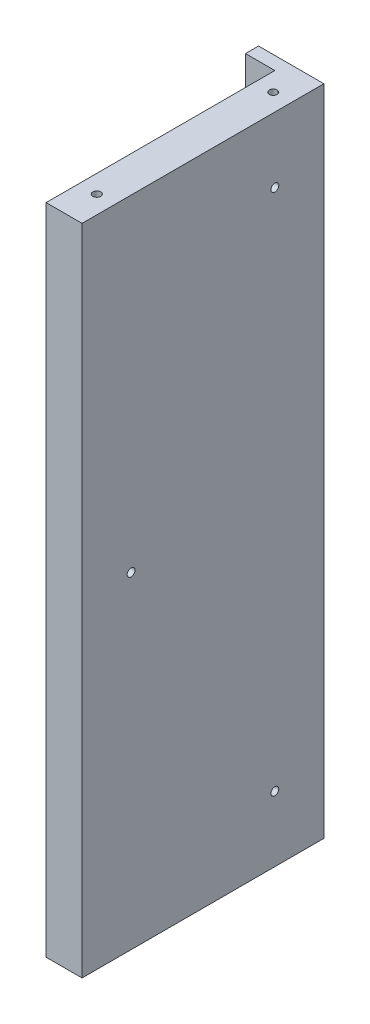
ISO-10303-21;
HEADER;
FILE_DESCRIPTION(('STEP AP214'),'2;1');
FILE_NAME('part.step','',(''),(''),'','','');
FILE_SCHEMA(('AUTOMOTIVE_DESIGN { 1 0 10303 214 1 1 1 1 }'));
ENDSEC;
DATA;
#1=APPLICATION_CONTEXT('core data for automotive mechanical design processes');
#2=APPLICATION_PROTOCOL_DEFINITION('international standard','automotive_design',2000,#1);
#3=PRODUCT_CONTEXT('',#1,'mechanical');
#4=PRODUCT('Part','Part','',(#3));
#5=PRODUCT_RELATED_PRODUCT_CATEGORY('part','',(#4));
#6=PRODUCT_DEFINITION_FORMATION('','',#4);
#7=PRODUCT_DEFINITION_CONTEXT('part definition',#1,'design');
#8=PRODUCT_DEFINITION('design','',#6,#7);
#9=PRODUCT_DEFINITION_SHAPE('','',#8);
#10=(LENGTH_UNIT() NAMED_UNIT(*) SI_UNIT(.MILLI.,.METRE.));
#11=(NAMED_UNIT(*) PLANE_ANGLE_UNIT() SI_UNIT($,.RADIAN.));
#12=(NAMED_UNIT(*) SI_UNIT($,.STERADIAN.) SOLID_ANGLE_UNIT());
#13=UNCERTAINTY_MEASURE_WITH_UNIT(LENGTH_MEASURE(1.E-05),#10,'distance_accuracy_value','');
#14=(GEOMETRIC_REPRESENTATION_CONTEXT(3) GLOBAL_UNCERTAINTY_ASSIGNED_CONTEXT((#13)) GLOBAL_UNIT_ASSIGNED_CONTEXT((#10,
#11,#12)) REPRESENTATION_CONTEXT('',''));
#15=CARTESIAN_POINT('',(0.,0.,0.));
#16=DIRECTION('',(0.,0.,1.));
#17=DIRECTION('',(1.,0.,0.));
#18=AXIS2_PLACEMENT_3D('',#15,#16,#17);
#19=CARTESIAN_POINT('',(9.99999999999999,200.,-50.));
#20=DIRECTION('',(-1.,0.,0.));
#21=DIRECTION('',(0.,0.,1.));
#22=AXIS2_PLACEMENT_3D('',#19,#20,#21);
#23=PLANE('',#22);
#24=CARTESIAN_POINT('',(10.,20.,-9.00000000000002));
#25=DIRECTION('',(1.,0.,0.));
#26=DIRECTION('',(0.,0.,-1.));
#27=AXIS2_PLACEMENT_3D('',#24,#25,#26);
#28=CIRCLE('',#27,1.19999999999999);
#29=CARTESIAN_POINT('',(10.,20.,-10.2));
#30=VERTEX_POINT('',#29);
#31=EDGE_CURVE('E214',#30,#30,#28,.T.);
#32=ORIENTED_EDGE('',*,*,#31,.F.);
#33=EDGE_LOOP('',(#32));
#34=FACE_BOUND('',#33,.T.);
#35=CARTESIAN_POINT('',(10.,180.,-9.00000000000002));
#36=DIRECTION('',(1.,0.,0.));
#37=DIRECTION('',(0.,0.,-1.));
#38=AXIS2_PLACEMENT_3D('',#35,#36,#37);
#39=CIRCLE('',#38,1.19999999999998);
#40=CARTESIAN_POINT('',(10.,180.,-10.2));
#41=VERTEX_POINT('',#40);
#42=EDGE_CURVE('E218',#41,#41,#39,.T.);
#43=ORIENTED_EDGE('',*,*,#42,.F.);
#44=EDGE_LOOP('',(#43));
#45=FACE_BOUND('',#44,.T.);
#46=CARTESIAN_POINT('',(10.,100.,35.));
#47=DIRECTION('',(1.,0.,0.));
#48=DIRECTION('',(0.,0.,-1.));
#49=AXIS2_PLACEMENT_3D('',#46,#47,#48);
#50=CIRCLE('',#49,1.19999999999999);
#51=CARTESIAN_POINT('',(10.,100.,33.8));
#52=VERTEX_POINT('',#51);
#53=EDGE_CURVE('E222',#52,#52,#50,.T.);
#54=ORIENTED_EDGE('',*,*,#53,.F.);
#55=EDGE_LOOP('',(#54));
#56=FACE_BOUND('',#55,.T.);
#57=DIRECTION('',(0.,0.,-1.));
#58=VECTOR('',#57,1.);
#59=CARTESIAN_POINT('',(9.99999999999999,0.,-50.));
#60=LINE('',#59,#58);
#61=CARTESIAN_POINT('',(10.,0.,50.));
#62=VERTEX_POINT('',#61);
#63=CARTESIAN_POINT('',(10.,0.,-24.));
#64=VERTEX_POINT('',#63);
#65=EDGE_CURVE('E165',#62,#64,#60,.T.);
#66=ORIENTED_EDGE('',*,*,#65,.T.);
#67=DIRECTION('',(0.,-1.,0.));
#68=VECTOR('',#67,1.);
#69=CARTESIAN_POINT('',(9.99999999999999,200.,-24.));
#70=LINE('',#69,#68);
#71=CARTESIAN_POINT('',(9.99999999999999,200.,-24.));
#72=VERTEX_POINT('',#71);
#73=EDGE_CURVE('E51',#72,#64,#70,.T.);
#74=ORIENTED_EDGE('',*,*,#73,.F.);
#75=DIRECTION('',(0.,0.,-1.));
#76=VECTOR('',#75,1.);
#77=CARTESIAN_POINT('',(9.99999999999999,200.,-50.));
#78=LINE('',#77,#76);
#79=CARTESIAN_POINT('',(10.,200.,50.));
#80=VERTEX_POINT('',#79);
#81=EDGE_CURVE('E169',#80,#72,#78,.T.);
#82=ORIENTED_EDGE('',*,*,#81,.F.);
#83=DIRECTION('',(0.,-1.,0.));
#84=VECTOR('',#83,1.);
#85=CARTESIAN_POINT('',(10.,200.,50.));
#86=LINE('',#85,#84);
#87=EDGE_CURVE('E11',#80,#62,#86,.T.);
#88=ORIENTED_EDGE('',*,*,#87,.T.);
#89=EDGE_LOOP('',(#66,#74,#82,#88));
#90=FACE_BOUND('',#89,.T.);
#91=ADVANCED_FACE('F35',(#34,#45,#56,#90),#23,.F.);
#92=CARTESIAN_POINT('',(-10.,200.,-50.));
#93=DIRECTION('',(1.,0.,0.));
#94=DIRECTION('',(0.,0.,-1.));
#95=AXIS2_PLACEMENT_3D('',#92,#93,#94);
#96=PLANE('',#95);
#97=DIRECTION('',(0.,0.,1.));
#98=VECTOR('',#97,1.);
#99=CARTESIAN_POINT('',(-10.,200.,-50.));
#100=LINE('',#99,#98);
#101=CARTESIAN_POINT('',(-10.,200.,-24.));
#102=VERTEX_POINT('',#101);
#103=CARTESIAN_POINT('',(-9.99999999999999,200.,-20.));
#104=VERTEX_POINT('',#103);
#105=EDGE_CURVE('E172',#102,#104,#100,.T.);
#106=ORIENTED_EDGE('',*,*,#105,.F.);
#107=DIRECTION('',(0.,-1.,0.));
#108=VECTOR('',#107,1.);
#109=CARTESIAN_POINT('',(-10.,200.,-24.));
#110=LINE('',#109,#108);
#111=CARTESIAN_POINT('',(-10.,0.,-24.));
#112=VERTEX_POINT('',#111);
#113=EDGE_CURVE('E128',#102,#112,#110,.T.);
#114=ORIENTED_EDGE('',*,*,#113,.T.);
#115=DIRECTION('',(0.,0.,1.));
#116=VECTOR('',#115,1.);
#117=CARTESIAN_POINT('',(-10.,0.,-50.));
#118=LINE('',#117,#116);
#119=CARTESIAN_POINT('',(-9.99999999999999,0.,-20.));
#120=VERTEX_POINT('',#119);
#121=EDGE_CURVE('E178',#112,#120,#118,.T.);
#122=ORIENTED_EDGE('',*,*,#121,.T.);
#123=DIRECTION('',(0.,1.,0.));
#124=VECTOR('',#123,1.);
#125=CARTESIAN_POINT('',(-9.99999999999999,0.,-20.));
#126=LINE('',#125,#124);
#127=EDGE_CURVE('E162',#120,#104,#126,.T.);
#128=ORIENTED_EDGE('',*,*,#127,.T.);
#129=EDGE_LOOP('',(#106,#114,#122,#128));
#130=FACE_BOUND('',#129,.T.);
#131=ADVANCED_FACE('F204',(#130),#96,.F.);
#132=CARTESIAN_POINT('',(-9.99999999999999,200.,50.));
#133=DIRECTION('',(0.,0.,-1.));
#134=DIRECTION('',(-1.,0.,0.));
#135=AXIS2_PLACEMENT_3D('',#132,#133,#134);
#136=PLANE('',#135);
#137=DIRECTION('',(1.,0.,0.));
#138=VECTOR('',#137,1.);
#139=CARTESIAN_POINT('',(-9.99999999999999,200.,50.));
#140=LINE('',#139,#138);
#141=CARTESIAN_POINT('',(-0.999999999999996,200.,50.));
#142=VERTEX_POINT('',#141);
#143=EDGE_CURVE('E43',#142,#80,#140,.T.);
#144=ORIENTED_EDGE('',*,*,#143,.F.);
#145=DIRECTION('',(0.,1.,0.));
#146=VECTOR('',#145,1.);
#147=CARTESIAN_POINT('',(-0.999999999999996,0.,50.));
#148=LINE('',#147,#146);
#149=CARTESIAN_POINT('',(-0.999999999999996,0.,50.));
#150=VERTEX_POINT('',#149);
#151=EDGE_CURVE('E157',#150,#142,#148,.T.);
#152=ORIENTED_EDGE('',*,*,#151,.F.);
#153=DIRECTION('',(1.,0.,0.));
#154=VECTOR('',#153,1.);
#155=CARTESIAN_POINT('',(-9.99999999999999,0.,50.));
#156=LINE('',#155,#154);
#157=EDGE_CURVE('E173',#150,#62,#156,.T.);
#158=ORIENTED_EDGE('',*,*,#157,.T.);
#159=ORIENTED_EDGE('',*,*,#87,.F.);
#160=EDGE_LOOP('',(#144,#152,#158,#159));
#161=FACE_BOUND('',#160,.T.);
#162=ADVANCED_FACE('F209',(#161),#136,.F.);
#163=CARTESIAN_POINT('',(0.,200.,0.));
#164=DIRECTION('',(0.,1.,0.));
#165=DIRECTION('',(0.,0.,1.));
#166=AXIS2_PLACEMENT_3D('',#163,#164,#165);
#167=PLANE('',#166);
#168=CARTESIAN_POINT('',(4.50000000000001,200.,-14.));
#169=DIRECTION('',(0.,1.,0.));
#170=DIRECTION('',(0.,0.,1.));
#171=AXIS2_PLACEMENT_3D('',#168,#169,#170);
#172=CIRCLE('',#171,1.19999999999999);
#173=CARTESIAN_POINT('',(4.50000000000001,200.,-12.8));
#174=VERTEX_POINT('',#173);
#175=EDGE_CURVE('E111',#174,#174,#172,.T.);
#176=ORIENTED_EDGE('',*,*,#175,.F.);
#177=EDGE_LOOP('',(#176));
#178=FACE_BOUND('',#177,.T.);
#179=DIRECTION('',(-1.,0.,0.));
#180=VECTOR('',#179,1.);
#181=CARTESIAN_POINT('',(9.99999999999999,200.,-24.));
#182=LINE('',#181,#180);
#183=EDGE_CURVE('E124',#72,#102,#182,.T.);
#184=ORIENTED_EDGE('',*,*,#183,.T.);
#185=ORIENTED_EDGE('',*,*,#105,.T.);
#186=DIRECTION('',(-1.,0.,0.));
#187=VECTOR('',#186,1.);
#188=CARTESIAN_POINT('',(-9.99999999999999,200.,-20.));
#189=LINE('',#188,#187);
#190=CARTESIAN_POINT('',(-0.999999999999996,200.,-20.));
#191=VERTEX_POINT('',#190);
#192=EDGE_CURVE('E155',#191,#104,#189,.T.);
#193=ORIENTED_EDGE('',*,*,#192,.F.);
#194=DIRECTION('',(0.,0.,-1.));
#195=VECTOR('',#194,1.);
#196=CARTESIAN_POINT('',(-0.999999999999996,200.,50.));
#197=LINE('',#196,#195);
#198=EDGE_CURVE('E151',#142,#191,#197,.T.);
#199=ORIENTED_EDGE('',*,*,#198,.F.);
#200=ORIENTED_EDGE('',*,*,#143,.T.);
#201=ORIENTED_EDGE('',*,*,#81,.T.);
#202=EDGE_LOOP('',(#184,#185,#193,#199,#200,#201));
#203=FACE_BOUND('',#202,.T.);
#204=CARTESIAN_POINT('',(4.50000000000001,200.,40.));
#205=DIRECTION('',(0.,1.,0.));
#206=DIRECTION('',(0.,0.,1.));
#207=AXIS2_PLACEMENT_3D('',#204,#205,#206);
#208=CIRCLE('',#207,1.19999999999999);
#209=CARTESIAN_POINT('',(4.50000000000001,200.,41.2));
#210=VERTEX_POINT('',#209);
#211=EDGE_CURVE('E145',#210,#210,#208,.T.);
#212=ORIENTED_EDGE('',*,*,#211,.F.);
#213=EDGE_LOOP('',(#212));
#214=FACE_BOUND('',#213,.T.);
#215=ADVANCED_FACE('F234',(#178,#203,#214),#167,.T.);
#216=CARTESIAN_POINT('',(0.,0.,0.));
#217=DIRECTION('',(0.,1.,0.));
#218=DIRECTION('',(0.,0.,1.));
#219=AXIS2_PLACEMENT_3D('',#216,#217,#218);
#220=PLANE('',#219);
#221=CARTESIAN_POINT('',(4.50000000000001,0.,-14.));
#222=DIRECTION('',(0.,-1.,0.));
#223=DIRECTION('',(0.,0.,-1.));
#224=AXIS2_PLACEMENT_3D('',#221,#222,#223);
#225=CIRCLE('',#224,1.19999999999999);
#226=CARTESIAN_POINT('',(4.50000000000001,0.,-15.2));
#227=VERTEX_POINT('',#226);
#228=EDGE_CURVE('E110',#227,#227,#225,.T.);
#229=ORIENTED_EDGE('',*,*,#228,.F.);
#230=EDGE_LOOP('',(#229));
#231=FACE_BOUND('',#230,.T.);
#232=CARTESIAN_POINT('',(4.50000000000001,0.,40.));
#233=DIRECTION('',(0.,-1.,0.));
#234=DIRECTION('',(0.,0.,-1.));
#235=AXIS2_PLACEMENT_3D('',#232,#233,#234);
#236=CIRCLE('',#235,1.19999999999999);
#237=CARTESIAN_POINT('',(4.50000000000001,0.,38.8));
#238=VERTEX_POINT('',#237);
#239=EDGE_CURVE('E139',#238,#238,#236,.T.);
#240=ORIENTED_EDGE('',*,*,#239,.F.);
#241=EDGE_LOOP('',(#240));
#242=FACE_BOUND('',#241,.T.);
#243=ORIENTED_EDGE('',*,*,#121,.F.);
#244=DIRECTION('',(-1.,0.,0.));
#245=VECTOR('',#244,1.);
#246=CARTESIAN_POINT('',(9.99999999999999,0.,-24.));
#247=LINE('',#246,#245);
#248=EDGE_CURVE('E123',#64,#112,#247,.T.);
#249=ORIENTED_EDGE('',*,*,#248,.F.);
#250=ORIENTED_EDGE('',*,*,#65,.F.);
#251=ORIENTED_EDGE('',*,*,#157,.F.);
#252=DIRECTION('',(0.,0.,-1.));
#253=VECTOR('',#252,1.);
#254=CARTESIAN_POINT('',(-0.999999999999996,0.,50.));
#255=LINE('',#254,#253);
#256=CARTESIAN_POINT('',(-0.999999999999996,0.,-20.));
#257=VERTEX_POINT('',#256);
#258=EDGE_CURVE('E152',#150,#257,#255,.T.);
#259=ORIENTED_EDGE('',*,*,#258,.T.);
#260=DIRECTION('',(-1.,0.,0.));
#261=VECTOR('',#260,1.);
#262=CARTESIAN_POINT('',(-9.99999999999999,0.,-20.));
#263=LINE('',#262,#261);
#264=EDGE_CURVE('E59',#257,#120,#263,.T.);
#265=ORIENTED_EDGE('',*,*,#264,.T.);
#266=EDGE_LOOP('',(#243,#249,#250,#251,#259,#265));
#267=FACE_BOUND('',#266,.T.);
#268=ADVANCED_FACE('F229',(#231,#242,#267),#220,.F.);
#269=CARTESIAN_POINT('',(-9.99999999999999,0.,-20.));
#270=DIRECTION('',(0.,0.,-1.));
#271=DIRECTION('',(-1.,0.,0.));
#272=AXIS2_PLACEMENT_3D('',#269,#270,#271);
#273=PLANE('',#272);
#274=CARTESIAN_POINT('',(-5.00000000000001,190.,-20.));
#275=DIRECTION('',(0.,0.,-1.));
#276=DIRECTION('',(-1.,0.,0.));
#277=AXIS2_PLACEMENT_3D('',#274,#275,#276);
#278=CIRCLE('',#277,1.19999999999998);
#279=CARTESIAN_POINT('',(-6.19999999999999,190.,-20.));
#280=VERTEX_POINT('',#279);
#281=EDGE_CURVE('E135',#280,#280,#278,.T.);
#282=ORIENTED_EDGE('',*,*,#281,.T.);
#283=EDGE_LOOP('',(#282));
#284=FACE_BOUND('',#283,.T.);
#285=CARTESIAN_POINT('',(-5.00000000000001,10.,-20.));
#286=DIRECTION('',(0.,0.,-1.));
#287=DIRECTION('',(-1.,0.,0.));
#288=AXIS2_PLACEMENT_3D('',#285,#286,#287);
#289=CIRCLE('',#288,1.19999999999998);
#290=CARTESIAN_POINT('',(-6.19999999999999,10.,-20.));
#291=VERTEX_POINT('',#290);
#292=EDGE_CURVE('E136',#291,#291,#289,.T.);
#293=ORIENTED_EDGE('',*,*,#292,.T.);
#294=EDGE_LOOP('',(#293));
#295=FACE_BOUND('',#294,.T.);
#296=ORIENTED_EDGE('',*,*,#192,.T.);
#297=ORIENTED_EDGE('',*,*,#127,.F.);
#298=ORIENTED_EDGE('',*,*,#264,.F.);
#299=DIRECTION('',(0.,1.,0.));
#300=VECTOR('',#299,1.);
#301=CARTESIAN_POINT('',(-0.999999999999996,0.,-20.));
#302=LINE('',#301,#300);
#303=EDGE_CURVE('E166',#257,#191,#302,.T.);
#304=ORIENTED_EDGE('',*,*,#303,.T.);
#305=EDGE_LOOP('',(#296,#297,#298,#304));
#306=FACE_BOUND('',#305,.T.);
#307=ADVANCED_FACE('F183',(#284,#295,#306),#273,.F.);
#308=CARTESIAN_POINT('',(-0.999999999999996,0.,50.));
#309=DIRECTION('',(1.,0.,0.));
#310=DIRECTION('',(0.,0.,-1.));
#311=AXIS2_PLACEMENT_3D('',#308,#309,#310);
#312=PLANE('',#311);
#313=CARTESIAN_POINT('',(-0.999999999999997,20.,-9.00000000000002));
#314=DIRECTION('',(1.,0.,0.));
#315=DIRECTION('',(0.,0.,-1.));
#316=AXIS2_PLACEMENT_3D('',#313,#314,#315);
#317=CIRCLE('',#316,1.19999999999999);
#318=CARTESIAN_POINT('',(-0.999999999999998,20.,-10.2));
#319=VERTEX_POINT('',#318);
#320=EDGE_CURVE('E393',#319,#319,#317,.T.);
#321=ORIENTED_EDGE('',*,*,#320,.T.);
#322=EDGE_LOOP('',(#321));
#323=FACE_BOUND('',#322,.T.);
#324=CARTESIAN_POINT('',(-0.999999999999997,180.,-9.00000000000002));
#325=DIRECTION('',(1.,0.,0.));
#326=DIRECTION('',(0.,0.,-1.));
#327=AXIS2_PLACEMENT_3D('',#324,#325,#326);
#328=CIRCLE('',#327,1.19999999999998);
#329=CARTESIAN_POINT('',(-0.999999999999998,180.,-10.2));
#330=VERTEX_POINT('',#329);
#331=EDGE_CURVE('E398',#330,#330,#328,.T.);
#332=ORIENTED_EDGE('',*,*,#331,.T.);
#333=EDGE_LOOP('',(#332));
#334=FACE_BOUND('',#333,.T.);
#335=CARTESIAN_POINT('',(-0.999999999999992,100.,35.));
#336=DIRECTION('',(1.,0.,0.));
#337=DIRECTION('',(0.,0.,-1.));
#338=AXIS2_PLACEMENT_3D('',#335,#336,#337);
#339=CIRCLE('',#338,1.19999999999999);
#340=CARTESIAN_POINT('',(-0.999999999999992,100.,33.8));
#341=VERTEX_POINT('',#340);
#342=EDGE_CURVE('E117',#341,#341,#339,.T.);
#343=ORIENTED_EDGE('',*,*,#342,.T.);
#344=EDGE_LOOP('',(#343));
#345=FACE_BOUND('',#344,.T.);
#346=ORIENTED_EDGE('',*,*,#198,.T.);
#347=ORIENTED_EDGE('',*,*,#303,.F.);
#348=ORIENTED_EDGE('',*,*,#258,.F.);
#349=ORIENTED_EDGE('',*,*,#151,.T.);
#350=EDGE_LOOP('',(#346,#347,#348,#349));
#351=FACE_BOUND('',#350,.T.);
#352=ADVANCED_FACE('F238',(#323,#334,#345,#351),#312,.F.);
#353=CARTESIAN_POINT('',(4.50000000000001,196.,40.));
#354=DIRECTION('',(0.,1.,0.));
#355=DIRECTION('',(0.,0.,1.));
#356=AXIS2_PLACEMENT_3D('',#353,#354,#355);
#357=CONICAL_SURFACE('',#356,1.2,1.02974425867666);
#358=CARTESIAN_POINT('',(4.5,195.278967257167,40.));
#359=VERTEX_POINT('',#358);
#360=VERTEX_LOOP('',#359);
#361=FACE_BOUND('',#360,.T.);
#362=CARTESIAN_POINT('',(4.50000000000001,196.,40.));
#363=DIRECTION('',(0.,1.,0.));
#364=DIRECTION('',(0.,0.,1.));
#365=AXIS2_PLACEMENT_3D('',#362,#363,#364);
#366=CIRCLE('',#365,1.2);
#367=CARTESIAN_POINT('',(4.50000000000001,196.,41.2));
#368=VERTEX_POINT('',#367);
#369=EDGE_CURVE('E148',#368,#368,#366,.T.);
#370=ORIENTED_EDGE('',*,*,#369,.T.);
#371=EDGE_LOOP('',(#370));
#372=FACE_BOUND('',#371,.T.);
#373=ADVANCED_FACE('F255',(#361,#372),#357,.F.);
#374=CARTESIAN_POINT('',(4.50000000000001,200.,40.));
#375=DIRECTION('',(0.,1.,0.));
#376=DIRECTION('',(0.,0.,1.));
#377=AXIS2_PLACEMENT_3D('',#374,#375,#376);
#378=CYLINDRICAL_SURFACE('',#377,1.19999999999999);
#379=ORIENTED_EDGE('',*,*,#369,.F.);
#380=EDGE_LOOP('',(#379));
#381=FACE_BOUND('',#380,.T.);
#382=ORIENTED_EDGE('',*,*,#211,.T.);
#383=EDGE_LOOP('',(#382));
#384=FACE_BOUND('',#383,.T.);
#385=ADVANCED_FACE('F261',(#381,#384),#378,.F.);
#386=CARTESIAN_POINT('',(4.50000000000001,4.,40.));
#387=DIRECTION('',(0.,-1.,0.));
#388=DIRECTION('',(0.,0.,-1.));
#389=AXIS2_PLACEMENT_3D('',#386,#387,#388);
#390=CONICAL_SURFACE('',#389,1.19999999999999,1.02974425867665);
#391=CARTESIAN_POINT('',(4.5,4.72103274283307,40.));
#392=VERTEX_POINT('',#391);
#393=VERTEX_LOOP('',#392);
#394=FACE_BOUND('',#393,.T.);
#395=CARTESIAN_POINT('',(4.50000000000001,4.,40.));
#396=DIRECTION('',(0.,-1.,0.));
#397=DIRECTION('',(0.,0.,-1.));
#398=AXIS2_PLACEMENT_3D('',#395,#396,#397);
#399=CIRCLE('',#398,1.19999999999999);
#400=CARTESIAN_POINT('',(4.50000000000001,4.,38.8));
#401=VERTEX_POINT('',#400);
#402=EDGE_CURVE('E142',#401,#401,#399,.T.);
#403=ORIENTED_EDGE('',*,*,#402,.T.);
#404=EDGE_LOOP('',(#403));
#405=FACE_BOUND('',#404,.T.);
#406=ADVANCED_FACE('F265',(#394,#405),#390,.F.);
#407=CARTESIAN_POINT('',(4.50000000000001,0.,40.));
#408=DIRECTION('',(0.,-1.,0.));
#409=DIRECTION('',(0.,0.,-1.));
#410=AXIS2_PLACEMENT_3D('',#407,#408,#409);
#411=CYLINDRICAL_SURFACE('',#410,1.19999999999999);
#412=ORIENTED_EDGE('',*,*,#402,.F.);
#413=EDGE_LOOP('',(#412));
#414=FACE_BOUND('',#413,.T.);
#415=ORIENTED_EDGE('',*,*,#239,.T.);
#416=EDGE_LOOP('',(#415));
#417=FACE_BOUND('',#416,.T.);
#418=ADVANCED_FACE('F199',(#414,#417),#411,.F.);
#419=CARTESIAN_POINT('',(-5.00000000000001,10.,-50.));
#420=DIRECTION('',(0.,0.,-1.));
#421=DIRECTION('',(-1.,0.,0.));
#422=AXIS2_PLACEMENT_3D('',#419,#420,#421);
#423=CYLINDRICAL_SURFACE('',#422,1.19999999999998);
#424=CARTESIAN_POINT('',(-5.00000000000001,10.,-24.));
#425=DIRECTION('',(0.,0.,1.));
#426=DIRECTION('',(1.,0.,0.));
#427=AXIS2_PLACEMENT_3D('',#424,#425,#426);
#428=CIRCLE('',#427,1.19999999999998);
#429=CARTESIAN_POINT('',(-3.80000000000002,10.,-24.));
#430=VERTEX_POINT('',#429);
#431=EDGE_CURVE('E132',#430,#430,#428,.F.);
#432=ORIENTED_EDGE('',*,*,#431,.T.);
#433=EDGE_LOOP('',(#432));
#434=FACE_BOUND('',#433,.T.);
#435=ORIENTED_EDGE('',*,*,#292,.F.);
#436=EDGE_LOOP('',(#435));
#437=FACE_BOUND('',#436,.T.);
#438=ADVANCED_FACE('F189',(#434,#437),#423,.F.);
#439=CARTESIAN_POINT('',(-5.00000000000001,190.,-50.));
#440=DIRECTION('',(0.,0.,-1.));
#441=DIRECTION('',(-1.,0.,0.));
#442=AXIS2_PLACEMENT_3D('',#439,#440,#441);
#443=CYLINDRICAL_SURFACE('',#442,1.19999999999998);
#444=CARTESIAN_POINT('',(-5.00000000000001,190.,-24.));
#445=DIRECTION('',(0.,0.,1.));
#446=DIRECTION('',(1.,0.,0.));
#447=AXIS2_PLACEMENT_3D('',#444,#445,#446);
#448=CIRCLE('',#447,1.19999999999998);
#449=CARTESIAN_POINT('',(-3.80000000000002,190.,-24.));
#450=VERTEX_POINT('',#449);
#451=EDGE_CURVE('E38',#450,#450,#448,.F.);
#452=ORIENTED_EDGE('',*,*,#451,.T.);
#453=EDGE_LOOP('',(#452));
#454=FACE_BOUND('',#453,.T.);
#455=ORIENTED_EDGE('',*,*,#281,.F.);
#456=EDGE_LOOP('',(#455));
#457=FACE_BOUND('',#456,.T.);
#458=ADVANCED_FACE('F186',(#454,#457),#443,.F.);
#459=CARTESIAN_POINT('',(9.99999999999999,200.,-24.));
#460=DIRECTION('',(0.,0.,1.));
#461=DIRECTION('',(1.,0.,0.));
#462=AXIS2_PLACEMENT_3D('',#459,#460,#461);
#463=PLANE('',#462);
#464=ORIENTED_EDGE('',*,*,#451,.F.);
#465=EDGE_LOOP('',(#464));
#466=FACE_BOUND('',#465,.T.);
#467=ORIENTED_EDGE('',*,*,#248,.T.);
#468=ORIENTED_EDGE('',*,*,#113,.F.);
#469=ORIENTED_EDGE('',*,*,#183,.F.);
#470=ORIENTED_EDGE('',*,*,#73,.T.);
#471=EDGE_LOOP('',(#467,#468,#469,#470));
#472=FACE_BOUND('',#471,.T.);
#473=ORIENTED_EDGE('',*,*,#431,.F.);
#474=EDGE_LOOP('',(#473));
#475=FACE_BOUND('',#474,.T.);
#476=ADVANCED_FACE('F188',(#466,#472,#475),#463,.F.);
#477=CARTESIAN_POINT('',(4.50000000000001,11.,-14.));
#478=DIRECTION('',(0.,-1.,0.));
#479=DIRECTION('',(0.,0.,-1.));
#480=AXIS2_PLACEMENT_3D('',#477,#478,#479);
#481=CONICAL_SURFACE('',#480,1.19999999999999,1.02974425867665);
#482=CARTESIAN_POINT('',(4.5,11.7210327428331,-14.));
#483=VERTEX_POINT('',#482);
#484=VERTEX_LOOP('',#483);
#485=FACE_BOUND('',#484,.T.);
#486=CARTESIAN_POINT('',(4.50000000000001,11.,-14.));
#487=DIRECTION('',(0.,-1.,0.));
#488=DIRECTION('',(0.,0.,-1.));
#489=AXIS2_PLACEMENT_3D('',#486,#487,#488);
#490=CIRCLE('',#489,1.19999999999999);
#491=CARTESIAN_POINT('',(4.50000000000001,11.,-15.2));
#492=VERTEX_POINT('',#491);
#493=EDGE_CURVE('E114',#492,#492,#490,.T.);
#494=ORIENTED_EDGE('',*,*,#493,.T.);
#495=EDGE_LOOP('',(#494));
#496=FACE_BOUND('',#495,.T.);
#497=ADVANCED_FACE('F196',(#485,#496),#481,.F.);
#498=CARTESIAN_POINT('',(4.50000000000001,0.,-14.));
#499=DIRECTION('',(0.,-1.,0.));
#500=DIRECTION('',(0.,0.,-1.));
#501=AXIS2_PLACEMENT_3D('',#498,#499,#500);
#502=CYLINDRICAL_SURFACE('',#501,1.19999999999999);
#503=ORIENTED_EDGE('',*,*,#493,.F.);
#504=EDGE_LOOP('',(#503));
#505=FACE_BOUND('',#504,.T.);
#506=ORIENTED_EDGE('',*,*,#228,.T.);
#507=EDGE_LOOP('',(#506));
#508=FACE_BOUND('',#507,.T.);
#509=ADVANCED_FACE('F104',(#505,#508),#502,.F.);
#510=CARTESIAN_POINT('',(4.50000000000001,189.,-14.));
#511=DIRECTION('',(0.,1.,0.));
#512=DIRECTION('',(0.,0.,1.));
#513=AXIS2_PLACEMENT_3D('',#510,#511,#512);
#514=CONICAL_SURFACE('',#513,1.19999999999999,1.02974425867666);
#515=CARTESIAN_POINT('',(4.5,188.278967257167,-14.));
#516=VERTEX_POINT('',#515);
#517=VERTEX_LOOP('',#516);
#518=FACE_BOUND('',#517,.T.);
#519=CARTESIAN_POINT('',(4.50000000000001,189.,-14.));
#520=DIRECTION('',(0.,1.,0.));
#521=DIRECTION('',(0.,0.,1.));
#522=AXIS2_PLACEMENT_3D('',#519,#520,#521);
#523=CIRCLE('',#522,1.19999999999999);
#524=CARTESIAN_POINT('',(4.50000000000001,189.,-12.8));
#525=VERTEX_POINT('',#524);
#526=EDGE_CURVE('E108',#525,#525,#523,.T.);
#527=ORIENTED_EDGE('',*,*,#526,.T.);
#528=EDGE_LOOP('',(#527));
#529=FACE_BOUND('',#528,.T.);
#530=ADVANCED_FACE('F100',(#518,#529),#514,.F.);
#531=CARTESIAN_POINT('',(4.50000000000001,200.,-14.));
#532=DIRECTION('',(0.,1.,0.));
#533=DIRECTION('',(0.,0.,1.));
#534=AXIS2_PLACEMENT_3D('',#531,#532,#533);
#535=CYLINDRICAL_SURFACE('',#534,1.19999999999999);
#536=ORIENTED_EDGE('',*,*,#526,.F.);
#537=EDGE_LOOP('',(#536));
#538=FACE_BOUND('',#537,.T.);
#539=ORIENTED_EDGE('',*,*,#175,.T.);
#540=EDGE_LOOP('',(#539));
#541=FACE_BOUND('',#540,.T.);
#542=ADVANCED_FACE('F103',(#538,#541),#535,.F.);
#543=CARTESIAN_POINT('',(10.,100.,35.));
#544=DIRECTION('',(1.,0.,0.));
#545=DIRECTION('',(0.,0.,-1.));
#546=AXIS2_PLACEMENT_3D('',#543,#544,#545);
#547=CYLINDRICAL_SURFACE('',#546,1.19999999999999);
#548=ORIENTED_EDGE('',*,*,#342,.F.);
#549=EDGE_LOOP('',(#548));
#550=FACE_BOUND('',#549,.T.);
#551=ORIENTED_EDGE('',*,*,#53,.T.);
#552=EDGE_LOOP('',(#551));
#553=FACE_BOUND('',#552,.T.);
#554=ADVANCED_FACE('F345',(#550,#553),#547,.F.);
#555=CARTESIAN_POINT('',(10.,180.,-9.00000000000002));
#556=DIRECTION('',(1.,0.,0.));
#557=DIRECTION('',(0.,0.,-1.));
#558=AXIS2_PLACEMENT_3D('',#555,#556,#557);
#559=CYLINDRICAL_SURFACE('',#558,1.19999999999998);
#560=ORIENTED_EDGE('',*,*,#331,.F.);
#561=EDGE_LOOP('',(#560));
#562=FACE_BOUND('',#561,.T.);
#563=ORIENTED_EDGE('',*,*,#42,.T.);
#564=EDGE_LOOP('',(#563));
#565=FACE_BOUND('',#564,.T.);
#566=ADVANCED_FACE('F366',(#562,#565),#559,.F.);
#567=CARTESIAN_POINT('',(10.,20.,-9.00000000000002));
#568=DIRECTION('',(1.,0.,0.));
#569=DIRECTION('',(0.,0.,-1.));
#570=AXIS2_PLACEMENT_3D('',#567,#568,#569);
#571=CYLINDRICAL_SURFACE('',#570,1.19999999999999);
#572=ORIENTED_EDGE('',*,*,#320,.F.);
#573=EDGE_LOOP('',(#572));
#574=FACE_BOUND('',#573,.T.);
#575=ORIENTED_EDGE('',*,*,#31,.T.);
#576=EDGE_LOOP('',(#575));
#577=FACE_BOUND('',#576,.T.);
#578=ADVANCED_FACE('F376',(#574,#577),#571,.F.);
#579=CLOSED_SHELL('',(#91,#131,#162,#215,#268,#307,#352,#373,#385,#406,#418,#438,#458,#476,#497,
#509,#530,#542,#554,#566,#578));
#580=MANIFOLD_SOLID_BREP('B2',#579);
#581=ADVANCED_BREP_SHAPE_REPRESENTATION('',(#18,#580),#14);
#582=SHAPE_DEFINITION_REPRESENTATION(#9,#581);
ENDSEC;
END-ISO-10303-21;
